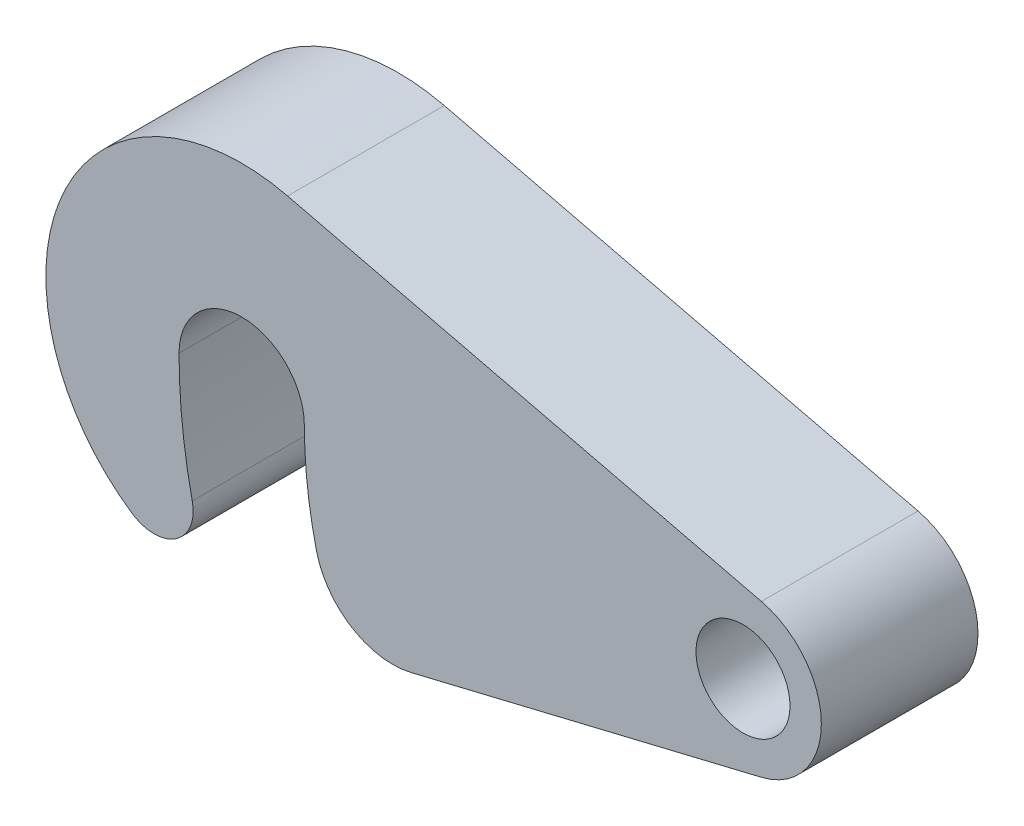
ISO-10303-21;
HEADER;
FILE_DESCRIPTION(('STEP AP214'),'2;1');
FILE_NAME('part.step','',(''),(''),'','','');
FILE_SCHEMA(('AUTOMOTIVE_DESIGN { 1 0 10303 214 1 1 1 1 }'));
ENDSEC;
DATA;
#1=APPLICATION_CONTEXT('core data for automotive mechanical design processes');
#2=APPLICATION_PROTOCOL_DEFINITION('international standard','automotive_design',2000,#1);
#3=PRODUCT_CONTEXT('',#1,'mechanical');
#4=PRODUCT('Part','Part','',(#3));
#5=PRODUCT_RELATED_PRODUCT_CATEGORY('part','',(#4));
#6=PRODUCT_DEFINITION_FORMATION('','',#4);
#7=PRODUCT_DEFINITION_CONTEXT('part definition',#1,'design');
#8=PRODUCT_DEFINITION('design','',#6,#7);
#9=PRODUCT_DEFINITION_SHAPE('','',#8);
#10=(LENGTH_UNIT() NAMED_UNIT(*) SI_UNIT(.MILLI.,.METRE.));
#11=(NAMED_UNIT(*) PLANE_ANGLE_UNIT() SI_UNIT($,.RADIAN.));
#12=(NAMED_UNIT(*) SI_UNIT($,.STERADIAN.) SOLID_ANGLE_UNIT());
#13=UNCERTAINTY_MEASURE_WITH_UNIT(LENGTH_MEASURE(1.E-05),#10,'distance_accuracy_value','');
#14=(GEOMETRIC_REPRESENTATION_CONTEXT(3) GLOBAL_UNCERTAINTY_ASSIGNED_CONTEXT((#13)) GLOBAL_UNIT_ASSIGNED_CONTEXT((#10,
#11,#12)) REPRESENTATION_CONTEXT('',''));
#15=CARTESIAN_POINT('',(0.,0.,0.));
#16=DIRECTION('',(0.,0.,1.));
#17=DIRECTION('',(1.,0.,0.));
#18=AXIS2_PLACEMENT_3D('',#15,#16,#17);
#19=CARTESIAN_POINT('',(-11.1953125,-16.5730195808532,10.));
#20=DIRECTION('',(0.,0.,1.));
#21=DIRECTION('',(1.,0.,0.));
#22=AXIS2_PLACEMENT_3D('',#19,#20,#21);
#23=PLANE('',#22);
#24=CARTESIAN_POINT('',(-11.1953125,-16.5730195808532,10.));
#25=DIRECTION('',(0.,0.,1.));
#26=DIRECTION('',(1.,0.,0.));
#27=AXIS2_PLACEMENT_3D('',#24,#25,#26);
#28=CIRCLE('',#27,5.);
#29=CARTESIAN_POINT('',(-13.994140625,-20.7162744760665,10.));
#30=VERTEX_POINT('',#29);
#31=CARTESIAN_POINT('',(-6.31250000000001,-15.4968494782004,10.));
#32=VERTEX_POINT('',#31);
#33=EDGE_CURVE('E157',#30,#32,#28,.T.);
#34=ORIENTED_EDGE('',*,*,#33,.T.);
#35=CARTESIAN_POINT('',(64.,0.,10.));
#36=DIRECTION('',(0.,0.,-1.));
#37=DIRECTION('',(1.,0.,0.));
#38=AXIS2_PLACEMENT_3D('',#35,#36,#37);
#39=CIRCLE('',#38,72.);
#40=CARTESIAN_POINT('',(-8.,0.,10.));
#41=VERTEX_POINT('',#40);
#42=EDGE_CURVE('E100',#32,#41,#39,.T.);
#43=ORIENTED_EDGE('',*,*,#42,.T.);
#44=CARTESIAN_POINT('',(0.,0.,10.));
#45=DIRECTION('',(0.,0.,-1.));
#46=DIRECTION('',(1.,0.,0.));
#47=AXIS2_PLACEMENT_3D('',#44,#45,#46);
#48=CIRCLE('',#47,8.);
#49=CARTESIAN_POINT('',(8.,0.,10.));
#50=VERTEX_POINT('',#49);
#51=EDGE_CURVE('E175',#41,#50,#48,.T.);
#52=ORIENTED_EDGE('',*,*,#51,.T.);
#53=CARTESIAN_POINT('',(64.,0.,10.));
#54=DIRECTION('',(0.,0.,1.));
#55=DIRECTION('',(1.,0.,0.));
#56=AXIS2_PLACEMENT_3D('',#53,#54,#55);
#57=CIRCLE('',#56,56.);
#58=CARTESIAN_POINT('',(9.55980919394202,-13.125,10.));
#59=VERTEX_POINT('',#58);
#60=EDGE_CURVE('E192',#50,#59,#57,.T.);
#61=ORIENTED_EDGE('',*,*,#60,.T.);
#62=CARTESIAN_POINT('',(19.281271837881,-10.78125,10.));
#63=DIRECTION('',(0.,0.,1.));
#64=DIRECTION('',(-1.,0.,0.));
#65=AXIS2_PLACEMENT_3D('',#62,#63,#64);
#66=CIRCLE('',#65,10.);
#67=CARTESIAN_POINT('',(21.625021837881,-20.5027126439389,10.));
#68=VERTEX_POINT('',#67);
#69=EDGE_CURVE('E191',#59,#68,#66,.T.);
#70=ORIENTED_EDGE('',*,*,#69,.T.);
#71=DIRECTION('',(0.972146264393893,0.234375,0.));
#72=VECTOR('',#71,1.);
#73=CARTESIAN_POINT('',(21.625021837881,-20.5027126439389,10.));
#74=LINE('',#73,#72);
#75=CARTESIAN_POINT('',(66.34375,-9.72146264393892,10.));
#76=VERTEX_POINT('',#75);
#77=EDGE_CURVE('E122',#68,#76,#74,.T.);
#78=ORIENTED_EDGE('',*,*,#77,.T.);
#79=CARTESIAN_POINT('',(64.,0.,10.));
#80=DIRECTION('',(0.,0.,1.));
#81=DIRECTION('',(1.,0.,0.));
#82=AXIS2_PLACEMENT_3D('',#79,#80,#81);
#83=CIRCLE('',#82,10.);
#84=CARTESIAN_POINT('',(66.34375,9.72146264393892,10.));
#85=VERTEX_POINT('',#84);
#86=EDGE_CURVE('E116',#76,#85,#83,.T.);
#87=ORIENTED_EDGE('',*,*,#86,.T.);
#88=DIRECTION('',(-0.972146264393893,0.234375,0.));
#89=VECTOR('',#88,1.);
#90=CARTESIAN_POINT('',(5.859375,24.3036566098473,10.));
#91=LINE('',#90,#89);
#92=CARTESIAN_POINT('',(5.859375,24.3036566098473,10.));
#93=VERTEX_POINT('',#92);
#94=EDGE_CURVE('E120',#85,#93,#91,.T.);
#95=ORIENTED_EDGE('',*,*,#94,.T.);
#96=CARTESIAN_POINT('',(0.,0.,10.));
#97=DIRECTION('',(0.,0.,1.));
#98=DIRECTION('',(1.,0.,0.));
#99=AXIS2_PLACEMENT_3D('',#96,#97,#98);
#100=CIRCLE('',#99,25.);
#101=EDGE_CURVE('E54',#93,#30,#100,.T.);
#102=ORIENTED_EDGE('',*,*,#101,.T.);
#103=EDGE_LOOP('',(#34,#43,#52,#61,#70,#78,#87,#95,#102));
#104=FACE_BOUND('',#103,.T.);
#105=CARTESIAN_POINT('',(64.,0.,10.));
#106=DIRECTION('',(0.,0.,1.));
#107=DIRECTION('',(1.,0.,0.));
#108=AXIS2_PLACEMENT_3D('',#105,#106,#107);
#109=CIRCLE('',#108,6.);
#110=CARTESIAN_POINT('',(70.,0.,10.));
#111=VERTEX_POINT('',#110);
#112=EDGE_CURVE('E144',#111,#111,#109,.T.);
#113=ORIENTED_EDGE('',*,*,#112,.F.);
#114=EDGE_LOOP('',(#113));
#115=FACE_BOUND('',#114,.T.);
#116=ADVANCED_FACE('F37',(#104,#115),#23,.T.);
#117=CARTESIAN_POINT('',(-11.1953125,-16.5730195808532,-10.));
#118=DIRECTION('',(0.,0.,1.));
#119=DIRECTION('',(1.,0.,0.));
#120=AXIS2_PLACEMENT_3D('',#117,#118,#119);
#121=PLANE('',#120);
#122=CARTESIAN_POINT('',(-11.1953125,-16.5730195808532,-10.));
#123=DIRECTION('',(0.,0.,1.));
#124=DIRECTION('',(1.,0.,0.));
#125=AXIS2_PLACEMENT_3D('',#122,#123,#124);
#126=CIRCLE('',#125,5.);
#127=CARTESIAN_POINT('',(-13.994140625,-20.7162744760665,-10.));
#128=VERTEX_POINT('',#127);
#129=CARTESIAN_POINT('',(-6.31250000000001,-15.4968494782004,-10.));
#130=VERTEX_POINT('',#129);
#131=EDGE_CURVE('E140',#128,#130,#126,.T.);
#132=ORIENTED_EDGE('',*,*,#131,.F.);
#133=CARTESIAN_POINT('',(0.,0.,-10.));
#134=DIRECTION('',(0.,0.,1.));
#135=DIRECTION('',(1.,0.,0.));
#136=AXIS2_PLACEMENT_3D('',#133,#134,#135);
#137=CIRCLE('',#136,25.);
#138=CARTESIAN_POINT('',(5.859375,24.3036566098473,-10.));
#139=VERTEX_POINT('',#138);
#140=EDGE_CURVE('E92',#139,#128,#137,.T.);
#141=ORIENTED_EDGE('',*,*,#140,.F.);
#142=DIRECTION('',(-0.972146264393893,0.234375,0.));
#143=VECTOR('',#142,1.);
#144=CARTESIAN_POINT('',(5.859375,24.3036566098473,-10.));
#145=LINE('',#144,#143);
#146=CARTESIAN_POINT('',(66.34375,9.72146264393892,-10.));
#147=VERTEX_POINT('',#146);
#148=EDGE_CURVE('E86',#147,#139,#145,.T.);
#149=ORIENTED_EDGE('',*,*,#148,.F.);
#150=CARTESIAN_POINT('',(64.,0.,-10.));
#151=DIRECTION('',(0.,0.,1.));
#152=DIRECTION('',(1.,0.,0.));
#153=AXIS2_PLACEMENT_3D('',#150,#151,#152);
#154=CIRCLE('',#153,10.);
#155=CARTESIAN_POINT('',(66.34375,-9.72146264393892,-10.));
#156=VERTEX_POINT('',#155);
#157=EDGE_CURVE('E130',#156,#147,#154,.T.);
#158=ORIENTED_EDGE('',*,*,#157,.F.);
#159=DIRECTION('',(0.972146264393893,0.234375,0.));
#160=VECTOR('',#159,1.);
#161=CARTESIAN_POINT('',(21.625021837881,-20.5027126439389,-10.));
#162=LINE('',#161,#160);
#163=CARTESIAN_POINT('',(21.625021837881,-20.5027126439389,-10.));
#164=VERTEX_POINT('',#163);
#165=EDGE_CURVE('E152',#164,#156,#162,.T.);
#166=ORIENTED_EDGE('',*,*,#165,.F.);
#167=CARTESIAN_POINT('',(19.281271837881,-10.78125,-10.));
#168=DIRECTION('',(0.,0.,1.));
#169=DIRECTION('',(-1.,0.,0.));
#170=AXIS2_PLACEMENT_3D('',#167,#168,#169);
#171=CIRCLE('',#170,10.);
#172=CARTESIAN_POINT('',(9.55980919394202,-13.125,-10.));
#173=VERTEX_POINT('',#172);
#174=EDGE_CURVE('E150',#173,#164,#171,.T.);
#175=ORIENTED_EDGE('',*,*,#174,.F.);
#176=CARTESIAN_POINT('',(64.,0.,-10.));
#177=DIRECTION('',(0.,0.,1.));
#178=DIRECTION('',(1.,0.,0.));
#179=AXIS2_PLACEMENT_3D('',#176,#177,#178);
#180=CIRCLE('',#179,56.);
#181=CARTESIAN_POINT('',(8.,0.,-10.));
#182=VERTEX_POINT('',#181);
#183=EDGE_CURVE('E148',#182,#173,#180,.T.);
#184=ORIENTED_EDGE('',*,*,#183,.F.);
#185=CARTESIAN_POINT('',(0.,0.,-10.));
#186=DIRECTION('',(0.,0.,-1.));
#187=DIRECTION('',(1.,0.,0.));
#188=AXIS2_PLACEMENT_3D('',#185,#186,#187);
#189=CIRCLE('',#188,8.);
#190=CARTESIAN_POINT('',(-8.,0.,-10.));
#191=VERTEX_POINT('',#190);
#192=EDGE_CURVE('E146',#191,#182,#189,.T.);
#193=ORIENTED_EDGE('',*,*,#192,.F.);
#194=CARTESIAN_POINT('',(64.,0.,-10.));
#195=DIRECTION('',(0.,0.,-1.));
#196=DIRECTION('',(1.,0.,0.));
#197=AXIS2_PLACEMENT_3D('',#194,#195,#196);
#198=CIRCLE('',#197,72.);
#199=EDGE_CURVE('E143',#130,#191,#198,.T.);
#200=ORIENTED_EDGE('',*,*,#199,.F.);
#201=EDGE_LOOP('',(#132,#141,#149,#158,#166,#175,#184,#193,#200));
#202=FACE_BOUND('',#201,.T.);
#203=CARTESIAN_POINT('',(64.,0.,-10.));
#204=DIRECTION('',(0.,0.,1.));
#205=DIRECTION('',(1.,0.,0.));
#206=AXIS2_PLACEMENT_3D('',#203,#204,#205);
#207=CIRCLE('',#206,6.);
#208=CARTESIAN_POINT('',(70.,0.,-10.));
#209=VERTEX_POINT('',#208);
#210=EDGE_CURVE('E199',#209,#209,#207,.T.);
#211=ORIENTED_EDGE('',*,*,#210,.T.);
#212=EDGE_LOOP('',(#211));
#213=FACE_BOUND('',#212,.T.);
#214=ADVANCED_FACE('F179',(#202,#213),#121,.F.);
#215=CARTESIAN_POINT('',(-11.1953125,-16.5730195808532,10.));
#216=DIRECTION('',(0.,0.,-1.));
#217=DIRECTION('',(-1.,0.,0.));
#218=AXIS2_PLACEMENT_3D('',#215,#216,#217);
#219=CYLINDRICAL_SURFACE('',#218,5.);
#220=ORIENTED_EDGE('',*,*,#131,.T.);
#221=DIRECTION('',(0.,0.,-1.));
#222=VECTOR('',#221,1.);
#223=CARTESIAN_POINT('',(-6.31250000000001,-15.4968494782004,10.));
#224=LINE('',#223,#222);
#225=EDGE_CURVE('E11',#32,#130,#224,.T.);
#226=ORIENTED_EDGE('',*,*,#225,.F.);
#227=ORIENTED_EDGE('',*,*,#33,.F.);
#228=DIRECTION('',(0.,0.,-1.));
#229=VECTOR('',#228,1.);
#230=CARTESIAN_POINT('',(-13.994140625,-20.7162744760665,10.));
#231=LINE('',#230,#229);
#232=EDGE_CURVE('E136',#30,#128,#231,.T.);
#233=ORIENTED_EDGE('',*,*,#232,.T.);
#234=EDGE_LOOP('',(#220,#226,#227,#233));
#235=FACE_BOUND('',#234,.T.);
#236=ADVANCED_FACE('F39',(#235),#219,.T.);
#237=CARTESIAN_POINT('',(64.,0.,10.));
#238=DIRECTION('',(0.,0.,-1.));
#239=DIRECTION('',(-1.,0.,0.));
#240=AXIS2_PLACEMENT_3D('',#237,#238,#239);
#241=CYLINDRICAL_SURFACE('',#240,72.);
#242=ORIENTED_EDGE('',*,*,#199,.T.);
#243=DIRECTION('',(0.,0.,-1.));
#244=VECTOR('',#243,1.);
#245=CARTESIAN_POINT('',(-8.,0.,10.));
#246=LINE('',#245,#244);
#247=EDGE_CURVE('E46',#41,#191,#246,.T.);
#248=ORIENTED_EDGE('',*,*,#247,.F.);
#249=ORIENTED_EDGE('',*,*,#42,.F.);
#250=ORIENTED_EDGE('',*,*,#225,.T.);
#251=EDGE_LOOP('',(#242,#248,#249,#250));
#252=FACE_BOUND('',#251,.T.);
#253=ADVANCED_FACE('F231',(#252),#241,.F.);
#254=CARTESIAN_POINT('',(0.,0.,10.));
#255=DIRECTION('',(0.,0.,-1.));
#256=DIRECTION('',(-1.,0.,0.));
#257=AXIS2_PLACEMENT_3D('',#254,#255,#256);
#258=CYLINDRICAL_SURFACE('',#257,8.);
#259=ORIENTED_EDGE('',*,*,#192,.T.);
#260=DIRECTION('',(0.,0.,-1.));
#261=VECTOR('',#260,1.);
#262=CARTESIAN_POINT('',(8.,0.,10.));
#263=LINE('',#262,#261);
#264=EDGE_CURVE('E167',#50,#182,#263,.T.);
#265=ORIENTED_EDGE('',*,*,#264,.F.);
#266=ORIENTED_EDGE('',*,*,#51,.F.);
#267=ORIENTED_EDGE('',*,*,#247,.T.);
#268=EDGE_LOOP('',(#259,#265,#266,#267));
#269=FACE_BOUND('',#268,.T.);
#270=ADVANCED_FACE('F173',(#269),#258,.F.);
#271=CARTESIAN_POINT('',(64.,0.,10.));
#272=DIRECTION('',(0.,0.,-1.));
#273=DIRECTION('',(-1.,0.,0.));
#274=AXIS2_PLACEMENT_3D('',#271,#272,#273);
#275=CYLINDRICAL_SURFACE('',#274,56.);
#276=ORIENTED_EDGE('',*,*,#183,.T.);
#277=DIRECTION('',(0.,0.,-1.));
#278=VECTOR('',#277,1.);
#279=CARTESIAN_POINT('',(9.55980919394202,-13.125,10.));
#280=LINE('',#279,#278);
#281=EDGE_CURVE('E164',#59,#173,#280,.T.);
#282=ORIENTED_EDGE('',*,*,#281,.F.);
#283=ORIENTED_EDGE('',*,*,#60,.F.);
#284=ORIENTED_EDGE('',*,*,#264,.T.);
#285=EDGE_LOOP('',(#276,#282,#283,#284));
#286=FACE_BOUND('',#285,.T.);
#287=ADVANCED_FACE('F185',(#286),#275,.T.);
#288=CARTESIAN_POINT('',(19.281271837881,-10.78125,10.));
#289=DIRECTION('',(0.,0.,-1.));
#290=DIRECTION('',(-1.,0.,0.));
#291=AXIS2_PLACEMENT_3D('',#288,#289,#290);
#292=CYLINDRICAL_SURFACE('',#291,10.);
#293=ORIENTED_EDGE('',*,*,#174,.T.);
#294=DIRECTION('',(0.,0.,-1.));
#295=VECTOR('',#294,1.);
#296=CARTESIAN_POINT('',(21.625021837881,-20.5027126439389,10.));
#297=LINE('',#296,#295);
#298=EDGE_CURVE('E161',#68,#164,#297,.T.);
#299=ORIENTED_EDGE('',*,*,#298,.F.);
#300=ORIENTED_EDGE('',*,*,#69,.F.);
#301=ORIENTED_EDGE('',*,*,#281,.T.);
#302=EDGE_LOOP('',(#293,#299,#300,#301));
#303=FACE_BOUND('',#302,.T.);
#304=ADVANCED_FACE('F189',(#303),#292,.T.);
#305=CARTESIAN_POINT('',(21.625021837881,-20.5027126439389,10.));
#306=DIRECTION('',(-0.234375,0.972146264393893,0.));
#307=DIRECTION('',(-0.972146264393893,-0.234375,0.));
#308=AXIS2_PLACEMENT_3D('',#305,#306,#307);
#309=PLANE('',#308);
#310=ORIENTED_EDGE('',*,*,#165,.T.);
#311=DIRECTION('',(0.,0.,-1.));
#312=VECTOR('',#311,1.);
#313=CARTESIAN_POINT('',(66.34375,-9.72146264393892,10.));
#314=LINE('',#313,#312);
#315=EDGE_CURVE('E131',#76,#156,#314,.T.);
#316=ORIENTED_EDGE('',*,*,#315,.F.);
#317=ORIENTED_EDGE('',*,*,#77,.F.);
#318=ORIENTED_EDGE('',*,*,#298,.T.);
#319=EDGE_LOOP('',(#310,#316,#317,#318));
#320=FACE_BOUND('',#319,.T.);
#321=ADVANCED_FACE('F222',(#320),#309,.F.);
#322=CARTESIAN_POINT('',(64.,0.,10.));
#323=DIRECTION('',(0.,0.,-1.));
#324=DIRECTION('',(-1.,0.,0.));
#325=AXIS2_PLACEMENT_3D('',#322,#323,#324);
#326=CYLINDRICAL_SURFACE('',#325,10.);
#327=ORIENTED_EDGE('',*,*,#157,.T.);
#328=DIRECTION('',(0.,0.,-1.));
#329=VECTOR('',#328,1.);
#330=CARTESIAN_POINT('',(66.34375,9.72146264393892,10.));
#331=LINE('',#330,#329);
#332=EDGE_CURVE('E127',#85,#147,#331,.T.);
#333=ORIENTED_EDGE('',*,*,#332,.F.);
#334=ORIENTED_EDGE('',*,*,#86,.F.);
#335=ORIENTED_EDGE('',*,*,#315,.T.);
#336=EDGE_LOOP('',(#327,#333,#334,#335));
#337=FACE_BOUND('',#336,.T.);
#338=ADVANCED_FACE('F128',(#337),#326,.T.);
#339=CARTESIAN_POINT('',(5.859375,24.3036566098473,10.));
#340=DIRECTION('',(-0.234375,-0.972146264393893,0.));
#341=DIRECTION('',(0.972146264393893,-0.234375,0.));
#342=AXIS2_PLACEMENT_3D('',#339,#340,#341);
#343=PLANE('',#342);
#344=ORIENTED_EDGE('',*,*,#148,.T.);
#345=DIRECTION('',(0.,0.,-1.));
#346=VECTOR('',#345,1.);
#347=CARTESIAN_POINT('',(5.859375,24.3036566098473,10.));
#348=LINE('',#347,#346);
#349=EDGE_CURVE('E132',#93,#139,#348,.T.);
#350=ORIENTED_EDGE('',*,*,#349,.F.);
#351=ORIENTED_EDGE('',*,*,#94,.F.);
#352=ORIENTED_EDGE('',*,*,#332,.T.);
#353=EDGE_LOOP('',(#344,#350,#351,#352));
#354=FACE_BOUND('',#353,.T.);
#355=ADVANCED_FACE('F134',(#354),#343,.F.);
#356=CARTESIAN_POINT('',(0.,0.,10.));
#357=DIRECTION('',(0.,0.,-1.));
#358=DIRECTION('',(-1.,0.,0.));
#359=AXIS2_PLACEMENT_3D('',#356,#357,#358);
#360=CYLINDRICAL_SURFACE('',#359,25.);
#361=ORIENTED_EDGE('',*,*,#140,.T.);
#362=ORIENTED_EDGE('',*,*,#232,.F.);
#363=ORIENTED_EDGE('',*,*,#101,.F.);
#364=ORIENTED_EDGE('',*,*,#349,.T.);
#365=EDGE_LOOP('',(#361,#362,#363,#364));
#366=FACE_BOUND('',#365,.T.);
#367=ADVANCED_FACE('F215',(#366),#360,.T.);
#368=CARTESIAN_POINT('',(64.,0.,10.));
#369=DIRECTION('',(0.,0.,-1.));
#370=DIRECTION('',(-1.,0.,0.));
#371=AXIS2_PLACEMENT_3D('',#368,#369,#370);
#372=CYLINDRICAL_SURFACE('',#371,6.);
#373=ORIENTED_EDGE('',*,*,#112,.T.);
#374=EDGE_LOOP('',(#373));
#375=FACE_BOUND('',#374,.T.);
#376=ORIENTED_EDGE('',*,*,#210,.F.);
#377=EDGE_LOOP('',(#376));
#378=FACE_BOUND('',#377,.T.);
#379=ADVANCED_FACE('F205',(#375,#378),#372,.F.);
#380=CLOSED_SHELL('',(#116,#214,#236,#253,#270,#287,#304,#321,#338,#355,#367,#379));
#381=MANIFOLD_SOLID_BREP('B2',#380);
#382=ADVANCED_BREP_SHAPE_REPRESENTATION('',(#18,#381),#14);
#383=SHAPE_DEFINITION_REPRESENTATION(#9,#382);
ENDSEC;
END-ISO-10303-21;
